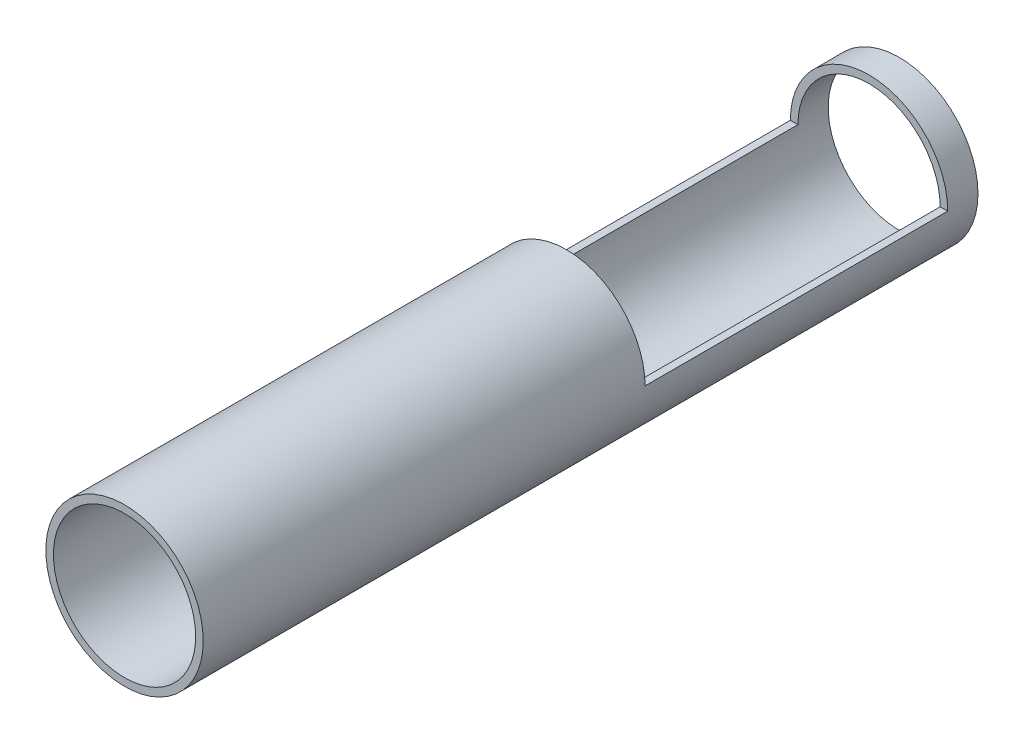
ISO-10303-21;
HEADER;
FILE_DESCRIPTION(('STEP AP214'),'2;1');
FILE_NAME('part.step','',(''),(''),'','','');
FILE_SCHEMA(('AUTOMOTIVE_DESIGN { 1 0 10303 214 1 1 1 1 }'));
ENDSEC;
DATA;
#1=APPLICATION_CONTEXT('core data for automotive mechanical design processes');
#2=APPLICATION_PROTOCOL_DEFINITION('international standard','automotive_design',2000,#1);
#3=PRODUCT_CONTEXT('',#1,'mechanical');
#4=PRODUCT('Part','Part','',(#3));
#5=PRODUCT_RELATED_PRODUCT_CATEGORY('part','',(#4));
#6=PRODUCT_DEFINITION_FORMATION('','',#4);
#7=PRODUCT_DEFINITION_CONTEXT('part definition',#1,'design');
#8=PRODUCT_DEFINITION('design','',#6,#7);
#9=PRODUCT_DEFINITION_SHAPE('','',#8);
#10=(LENGTH_UNIT() NAMED_UNIT(*) SI_UNIT(.MILLI.,.METRE.));
#11=(NAMED_UNIT(*) PLANE_ANGLE_UNIT() SI_UNIT($,.RADIAN.));
#12=(NAMED_UNIT(*) SI_UNIT($,.STERADIAN.) SOLID_ANGLE_UNIT());
#13=UNCERTAINTY_MEASURE_WITH_UNIT(LENGTH_MEASURE(1.E-05),#10,'distance_accuracy_value','');
#14=(GEOMETRIC_REPRESENTATION_CONTEXT(3) GLOBAL_UNCERTAINTY_ASSIGNED_CONTEXT((#13)) GLOBAL_UNIT_ASSIGNED_CONTEXT((#10,
#11,#12)) REPRESENTATION_CONTEXT('',''));
#15=CARTESIAN_POINT('',(0.,0.,0.));
#16=DIRECTION('',(0.,0.,1.));
#17=DIRECTION('',(1.,0.,0.));
#18=AXIS2_PLACEMENT_3D('',#15,#16,#17);
#19=CARTESIAN_POINT('',(0.,0.,128.));
#20=DIRECTION('',(0.,0.,-1.));
#21=DIRECTION('',(-1.,0.,0.));
#22=AXIS2_PLACEMENT_3D('',#19,#20,#21);
#23=CYLINDRICAL_SURFACE('',#22,11.75);
#24=CARTESIAN_POINT('',(0.,0.,128.));
#25=DIRECTION('',(0.,0.,1.));
#26=DIRECTION('',(1.,0.,0.));
#27=AXIS2_PLACEMENT_3D('',#24,#25,#26);
#28=CIRCLE('',#27,11.75);
#29=CARTESIAN_POINT('',(11.75,0.,128.));
#30=VERTEX_POINT('',#29);
#31=EDGE_CURVE('E98',#30,#30,#28,.T.);
#32=ORIENTED_EDGE('',*,*,#31,.T.);
#33=EDGE_LOOP('',(#32));
#34=FACE_BOUND('',#33,.T.);
#35=CARTESIAN_POINT('',(0.,0.,0.));
#36=DIRECTION('',(0.,0.,1.));
#37=DIRECTION('',(1.,0.,0.));
#38=AXIS2_PLACEMENT_3D('',#35,#36,#37);
#39=CIRCLE('',#38,11.75);
#40=CARTESIAN_POINT('',(11.75,0.,0.));
#41=VERTEX_POINT('',#40);
#42=EDGE_CURVE('E94',#41,#41,#39,.T.);
#43=ORIENTED_EDGE('',*,*,#42,.F.);
#44=EDGE_LOOP('',(#43));
#45=FACE_BOUND('',#44,.T.);
#46=CARTESIAN_POINT('',(0.,0.,55.));
#47=DIRECTION('',(0.,0.,-1.));
#48=DIRECTION('',(-1.,0.,0.));
#49=AXIS2_PLACEMENT_3D('',#46,#47,#48);
#50=CIRCLE('',#49,11.75);
#51=CARTESIAN_POINT('',(-11.75,0.,55.));
#52=VERTEX_POINT('',#51);
#53=CARTESIAN_POINT('',(11.75,0.,55.));
#54=VERTEX_POINT('',#53);
#55=EDGE_CURVE('E40',#52,#54,#50,.T.);
#56=ORIENTED_EDGE('',*,*,#55,.T.);
#57=DIRECTION('',(0.,0.,-1.));
#58=VECTOR('',#57,1.);
#59=CARTESIAN_POINT('',(11.75,0.,128.));
#60=LINE('',#59,#58);
#61=CARTESIAN_POINT('',(11.75,0.,5.));
#62=VERTEX_POINT('',#61);
#63=EDGE_CURVE('E11',#54,#62,#60,.T.);
#64=ORIENTED_EDGE('',*,*,#63,.T.);
#65=CARTESIAN_POINT('',(0.,0.,5.));
#66=DIRECTION('',(0.,0.,1.));
#67=DIRECTION('',(0.,-1.,0.));
#68=AXIS2_PLACEMENT_3D('',#65,#66,#67);
#69=CIRCLE('',#68,11.75);
#70=CARTESIAN_POINT('',(-11.75,0.,5.));
#71=VERTEX_POINT('',#70);
#72=EDGE_CURVE('E80',#62,#71,#69,.T.);
#73=ORIENTED_EDGE('',*,*,#72,.T.);
#74=DIRECTION('',(0.,0.,-1.));
#75=VECTOR('',#74,1.);
#76=CARTESIAN_POINT('',(-11.75,0.,128.));
#77=LINE('',#76,#75);
#78=EDGE_CURVE('E107',#71,#52,#77,.F.);
#79=ORIENTED_EDGE('',*,*,#78,.T.);
#80=EDGE_LOOP('',(#56,#64,#73,#79));
#81=FACE_BOUND('',#80,.T.);
#82=ADVANCED_FACE('F32',(#34,#45,#81),#23,.F.);
#83=CARTESIAN_POINT('',(0.,0.,128.));
#84=DIRECTION('',(0.,0.,1.));
#85=DIRECTION('',(1.,0.,0.));
#86=AXIS2_PLACEMENT_3D('',#83,#84,#85);
#87=PLANE('',#86);
#88=CARTESIAN_POINT('',(0.,0.,128.));
#89=DIRECTION('',(0.,0.,1.));
#90=DIRECTION('',(1.,0.,0.));
#91=AXIS2_PLACEMENT_3D('',#88,#89,#90);
#92=CIRCLE('',#91,13.);
#93=CARTESIAN_POINT('',(13.,0.,128.));
#94=VERTEX_POINT('',#93);
#95=EDGE_CURVE('E104',#94,#94,#92,.T.);
#96=ORIENTED_EDGE('',*,*,#95,.T.);
#97=EDGE_LOOP('',(#96));
#98=FACE_BOUND('',#97,.T.);
#99=ORIENTED_EDGE('',*,*,#31,.F.);
#100=EDGE_LOOP('',(#99));
#101=FACE_BOUND('',#100,.T.);
#102=ADVANCED_FACE('F125',(#98,#101),#87,.T.);
#103=CARTESIAN_POINT('',(0.,0.,0.));
#104=DIRECTION('',(0.,0.,1.));
#105=DIRECTION('',(1.,0.,0.));
#106=AXIS2_PLACEMENT_3D('',#103,#104,#105);
#107=PLANE('',#106);
#108=CARTESIAN_POINT('',(0.,0.,0.));
#109=DIRECTION('',(0.,0.,1.));
#110=DIRECTION('',(1.,0.,0.));
#111=AXIS2_PLACEMENT_3D('',#108,#109,#110);
#112=CIRCLE('',#111,13.);
#113=CARTESIAN_POINT('',(13.,0.,0.));
#114=VERTEX_POINT('',#113);
#115=EDGE_CURVE('E101',#114,#114,#112,.T.);
#116=ORIENTED_EDGE('',*,*,#115,.F.);
#117=EDGE_LOOP('',(#116));
#118=FACE_BOUND('',#117,.T.);
#119=ORIENTED_EDGE('',*,*,#42,.T.);
#120=EDGE_LOOP('',(#119));
#121=FACE_BOUND('',#120,.T.);
#122=ADVANCED_FACE('F131',(#118,#121),#107,.F.);
#123=CARTESIAN_POINT('',(0.,0.,128.));
#124=DIRECTION('',(0.,0.,-1.));
#125=DIRECTION('',(-1.,0.,0.));
#126=AXIS2_PLACEMENT_3D('',#123,#124,#125);
#127=CYLINDRICAL_SURFACE('',#126,13.);
#128=CARTESIAN_POINT('',(0.,0.,55.));
#129=DIRECTION('',(0.,0.,-1.));
#130=DIRECTION('',(-1.,0.,0.));
#131=AXIS2_PLACEMENT_3D('',#128,#129,#130);
#132=CIRCLE('',#131,13.);
#133=CARTESIAN_POINT('',(-13.,0.,55.));
#134=VERTEX_POINT('',#133);
#135=CARTESIAN_POINT('',(13.,0.,55.));
#136=VERTEX_POINT('',#135);
#137=EDGE_CURVE('E92',#134,#136,#132,.T.);
#138=ORIENTED_EDGE('',*,*,#137,.F.);
#139=DIRECTION('',(0.,0.,1.));
#140=VECTOR('',#139,1.);
#141=CARTESIAN_POINT('',(-13.,0.,5.));
#142=LINE('',#141,#140);
#143=CARTESIAN_POINT('',(-13.,0.,5.));
#144=VERTEX_POINT('',#143);
#145=EDGE_CURVE('E88',#144,#134,#142,.T.);
#146=ORIENTED_EDGE('',*,*,#145,.F.);
#147=CARTESIAN_POINT('',(0.,0.,5.));
#148=DIRECTION('',(0.,0.,1.));
#149=DIRECTION('',(0.,-1.,0.));
#150=AXIS2_PLACEMENT_3D('',#147,#148,#149);
#151=CIRCLE('',#150,13.);
#152=CARTESIAN_POINT('',(13.,0.,5.));
#153=VERTEX_POINT('',#152);
#154=EDGE_CURVE('E77',#153,#144,#151,.T.);
#155=ORIENTED_EDGE('',*,*,#154,.F.);
#156=DIRECTION('',(0.,0.,1.));
#157=VECTOR('',#156,1.);
#158=CARTESIAN_POINT('',(13.,0.,5.));
#159=LINE('',#158,#157);
#160=EDGE_CURVE('E84',#153,#136,#159,.T.);
#161=ORIENTED_EDGE('',*,*,#160,.T.);
#162=EDGE_LOOP('',(#138,#146,#155,#161));
#163=FACE_BOUND('',#162,.T.);
#164=ORIENTED_EDGE('',*,*,#95,.F.);
#165=EDGE_LOOP('',(#164));
#166=FACE_BOUND('',#165,.T.);
#167=ORIENTED_EDGE('',*,*,#115,.T.);
#168=EDGE_LOOP('',(#167));
#169=FACE_BOUND('',#168,.T.);
#170=ADVANCED_FACE('F34',(#163,#166,#169),#127,.T.);
#171=CARTESIAN_POINT('',(-13.,0.,55.));
#172=DIRECTION('',(0.,0.,-1.));
#173=DIRECTION('',(-1.,0.,0.));
#174=AXIS2_PLACEMENT_3D('',#171,#172,#173);
#175=PLANE('',#174);
#176=ORIENTED_EDGE('',*,*,#137,.T.);
#177=DIRECTION('',(1.,0.,0.));
#178=VECTOR('',#177,1.);
#179=CARTESIAN_POINT('',(-13.,0.,55.));
#180=LINE('',#179,#178);
#181=EDGE_CURVE('E47',#54,#136,#180,.T.);
#182=ORIENTED_EDGE('',*,*,#181,.F.);
#183=ORIENTED_EDGE('',*,*,#55,.F.);
#184=EDGE_CURVE('E55',#134,#52,#180,.T.);
#185=ORIENTED_EDGE('',*,*,#184,.F.);
#186=EDGE_LOOP('',(#176,#182,#183,#185));
#187=FACE_BOUND('',#186,.T.);
#188=ADVANCED_FACE('F115',(#187),#175,.T.);
#189=CARTESIAN_POINT('',(-13.,17.6453666164037,5.));
#190=DIRECTION('',(0.,0.,1.));
#191=DIRECTION('',(0.,-1.,0.));
#192=AXIS2_PLACEMENT_3D('',#189,#190,#191);
#193=PLANE('',#192);
#194=ORIENTED_EDGE('',*,*,#154,.T.);
#195=DIRECTION('',(1.,0.,0.));
#196=VECTOR('',#195,1.);
#197=CARTESIAN_POINT('',(-13.,0.,5.));
#198=LINE('',#197,#196);
#199=EDGE_CURVE('E81',#144,#71,#198,.T.);
#200=ORIENTED_EDGE('',*,*,#199,.T.);
#201=ORIENTED_EDGE('',*,*,#72,.F.);
#202=EDGE_CURVE('E73',#62,#153,#198,.T.);
#203=ORIENTED_EDGE('',*,*,#202,.T.);
#204=EDGE_LOOP('',(#194,#200,#201,#203));
#205=FACE_BOUND('',#204,.T.);
#206=ADVANCED_FACE('F74',(#205),#193,.T.);
#207=CARTESIAN_POINT('',(-13.,0.,5.));
#208=DIRECTION('',(0.,1.,0.));
#209=DIRECTION('',(0.,0.,1.));
#210=AXIS2_PLACEMENT_3D('',#207,#208,#209);
#211=PLANE('',#210);
#212=ORIENTED_EDGE('',*,*,#181,.T.);
#213=ORIENTED_EDGE('',*,*,#160,.F.);
#214=ORIENTED_EDGE('',*,*,#202,.F.);
#215=ORIENTED_EDGE('',*,*,#63,.F.);
#216=EDGE_LOOP('',(#212,#213,#214,#215));
#217=FACE_BOUND('',#216,.T.);
#218=ADVANCED_FACE('F85',(#217),#211,.T.);
#219=ORIENTED_EDGE('',*,*,#199,.F.);
#220=ORIENTED_EDGE('',*,*,#145,.T.);
#221=ORIENTED_EDGE('',*,*,#184,.T.);
#222=ORIENTED_EDGE('',*,*,#78,.F.);
#223=EDGE_LOOP('',(#219,#220,#221,#222));
#224=FACE_BOUND('',#223,.T.);
#225=ADVANCED_FACE('F117',(#224),#211,.T.);
#226=CLOSED_SHELL('',(#82,#102,#122,#170,#188,#206,#218,#225));
#227=MANIFOLD_SOLID_BREP('B2',#226);
#228=ADVANCED_BREP_SHAPE_REPRESENTATION('',(#18,#227),#14);
#229=SHAPE_DEFINITION_REPRESENTATION(#9,#228);
ENDSEC;
END-ISO-10303-21;
